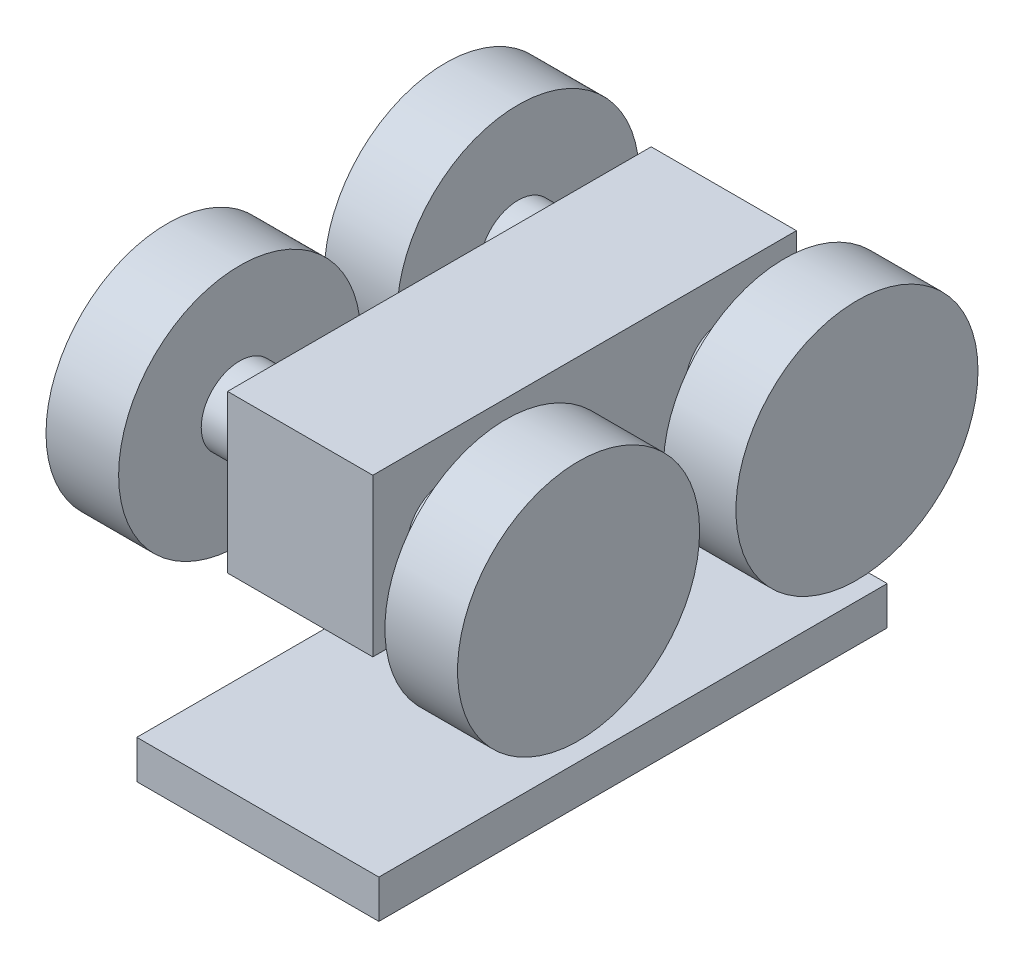
ISO-10303-21;
HEADER;
FILE_DESCRIPTION(('STEP AP214'),'2;1');
FILE_NAME('part.step','',(''),(''),'','','');
FILE_SCHEMA(('AUTOMOTIVE_DESIGN { 1 0 10303 214 1 1 1 1 }'));
ENDSEC;
DATA;
#1=APPLICATION_CONTEXT('core data for automotive mechanical design processes');
#2=APPLICATION_PROTOCOL_DEFINITION('international standard','automotive_design',2000,#1);
#3=PRODUCT_CONTEXT('',#1,'mechanical');
#4=PRODUCT('Part','Part','',(#3));
#5=PRODUCT_RELATED_PRODUCT_CATEGORY('part','',(#4));
#6=PRODUCT_DEFINITION_FORMATION('','',#4);
#7=PRODUCT_DEFINITION_CONTEXT('part definition',#1,'design');
#8=PRODUCT_DEFINITION('design','',#6,#7);
#9=PRODUCT_DEFINITION_SHAPE('','',#8);
#10=(LENGTH_UNIT() NAMED_UNIT(*) SI_UNIT(.MILLI.,.METRE.));
#11=(NAMED_UNIT(*) PLANE_ANGLE_UNIT() SI_UNIT($,.RADIAN.));
#12=(NAMED_UNIT(*) SI_UNIT($,.STERADIAN.) SOLID_ANGLE_UNIT());
#13=UNCERTAINTY_MEASURE_WITH_UNIT(LENGTH_MEASURE(1.E-05),#10,'distance_accuracy_value','');
#14=(GEOMETRIC_REPRESENTATION_CONTEXT(3) GLOBAL_UNCERTAINTY_ASSIGNED_CONTEXT((#13)) GLOBAL_UNIT_ASSIGNED_CONTEXT((#10,
#11,#12)) REPRESENTATION_CONTEXT('',''));
#15=CARTESIAN_POINT('',(0.,0.,0.));
#16=DIRECTION('',(0.,0.,1.));
#17=DIRECTION('',(1.,0.,0.));
#18=AXIS2_PLACEMENT_3D('',#15,#16,#17);
#19=CARTESIAN_POINT('',(27.,21.675,9.5));
#20=DIRECTION('',(-1.,0.,0.));
#21=DIRECTION('',(0.,0.,1.));
#22=AXIS2_PLACEMENT_3D('',#19,#20,#21);
#23=CYLINDRICAL_SURFACE('',#22,3.175);
#24=CARTESIAN_POINT('',(16.,21.675,9.5));
#25=DIRECTION('',(-1.,0.,0.));
#26=DIRECTION('',(0.,0.,1.));
#27=AXIS2_PLACEMENT_3D('',#24,#25,#26);
#28=CIRCLE('',#27,3.175);
#29=CARTESIAN_POINT('',(16.,21.675,12.675));
#30=VERTEX_POINT('',#29);
#31=EDGE_CURVE('E175',#30,#30,#28,.F.);
#32=ORIENTED_EDGE('',*,*,#31,.T.);
#33=EDGE_LOOP('',(#32));
#34=FACE_BOUND('',#33,.T.);
#35=CARTESIAN_POINT('',(21.,21.675,9.5));
#36=DIRECTION('',(1.,0.,0.));
#37=DIRECTION('',(0.,0.,-1.));
#38=AXIS2_PLACEMENT_3D('',#35,#36,#37);
#39=CIRCLE('',#38,3.175);
#40=CARTESIAN_POINT('',(21.,21.675,6.325));
#41=VERTEX_POINT('',#40);
#42=EDGE_CURVE('E11',#41,#41,#39,.T.);
#43=ORIENTED_EDGE('',*,*,#42,.F.);
#44=EDGE_LOOP('',(#43));
#45=FACE_BOUND('',#44,.T.);
#46=ADVANCED_FACE('F33',(#34,#45),#23,.T.);
#47=CARTESIAN_POINT('',(27.,21.675,32.5));
#48=DIRECTION('',(-1.,0.,0.));
#49=DIRECTION('',(0.,0.,1.));
#50=AXIS2_PLACEMENT_3D('',#47,#48,#49);
#51=CYLINDRICAL_SURFACE('',#50,3.175);
#52=CARTESIAN_POINT('',(16.,21.675,32.5));
#53=DIRECTION('',(-1.,0.,0.));
#54=DIRECTION('',(0.,0.,1.));
#55=AXIS2_PLACEMENT_3D('',#52,#53,#54);
#56=CIRCLE('',#55,3.175);
#57=CARTESIAN_POINT('',(16.,21.675,35.675));
#58=VERTEX_POINT('',#57);
#59=EDGE_CURVE('E172',#58,#58,#56,.F.);
#60=ORIENTED_EDGE('',*,*,#59,.T.);
#61=EDGE_LOOP('',(#60));
#62=FACE_BOUND('',#61,.T.);
#63=CARTESIAN_POINT('',(21.,21.675,32.5));
#64=DIRECTION('',(1.,0.,0.));
#65=DIRECTION('',(0.,0.,-1.));
#66=AXIS2_PLACEMENT_3D('',#63,#64,#65);
#67=CIRCLE('',#66,3.175);
#68=CARTESIAN_POINT('',(21.,21.675,29.325));
#69=VERTEX_POINT('',#68);
#70=EDGE_CURVE('E42',#69,#69,#67,.T.);
#71=ORIENTED_EDGE('',*,*,#70,.F.);
#72=EDGE_LOOP('',(#71));
#73=FACE_BOUND('',#72,.T.);
#74=ADVANCED_FACE('F189',(#62,#73),#51,.T.);
#75=CARTESIAN_POINT('',(-6.99999999999999,21.675,32.5));
#76=DIRECTION('',(1.,0.,0.));
#77=DIRECTION('',(0.,0.,-1.));
#78=AXIS2_PLACEMENT_3D('',#75,#76,#77);
#79=CYLINDRICAL_SURFACE('',#78,3.175);
#80=CARTESIAN_POINT('',(4.00000000000001,21.675,32.5));
#81=DIRECTION('',(1.,0.,0.));
#82=DIRECTION('',(0.,0.,-1.));
#83=AXIS2_PLACEMENT_3D('',#80,#81,#82);
#84=CIRCLE('',#83,3.175);
#85=CARTESIAN_POINT('',(4.00000000000001,21.675,29.325));
#86=VERTEX_POINT('',#85);
#87=EDGE_CURVE('E169',#86,#86,#84,.F.);
#88=ORIENTED_EDGE('',*,*,#87,.T.);
#89=EDGE_LOOP('',(#88));
#90=FACE_BOUND('',#89,.T.);
#91=CARTESIAN_POINT('',(-0.999999999999994,21.675,32.5));
#92=DIRECTION('',(-1.,0.,0.));
#93=DIRECTION('',(0.,0.,1.));
#94=AXIS2_PLACEMENT_3D('',#91,#92,#93);
#95=CIRCLE('',#94,3.175);
#96=CARTESIAN_POINT('',(-0.999999999999994,21.675,35.675));
#97=VERTEX_POINT('',#96);
#98=EDGE_CURVE('E181',#97,#97,#95,.T.);
#99=ORIENTED_EDGE('',*,*,#98,.F.);
#100=EDGE_LOOP('',(#99));
#101=FACE_BOUND('',#100,.T.);
#102=ADVANCED_FACE('F191',(#90,#101),#79,.T.);
#103=CARTESIAN_POINT('',(-6.99999999999999,21.675,9.5));
#104=DIRECTION('',(1.,0.,0.));
#105=DIRECTION('',(0.,0.,-1.));
#106=AXIS2_PLACEMENT_3D('',#103,#104,#105);
#107=CYLINDRICAL_SURFACE('',#106,3.175);
#108=CARTESIAN_POINT('',(4.00000000000001,21.675,9.5));
#109=DIRECTION('',(1.,0.,0.));
#110=DIRECTION('',(0.,0.,-1.));
#111=AXIS2_PLACEMENT_3D('',#108,#109,#110);
#112=CIRCLE('',#111,3.175);
#113=CARTESIAN_POINT('',(4.00000000000001,21.675,6.325));
#114=VERTEX_POINT('',#113);
#115=EDGE_CURVE('E166',#114,#114,#112,.F.);
#116=ORIENTED_EDGE('',*,*,#115,.T.);
#117=EDGE_LOOP('',(#116));
#118=FACE_BOUND('',#117,.T.);
#119=CARTESIAN_POINT('',(-0.999999999999994,21.675,9.5));
#120=DIRECTION('',(-1.,0.,0.));
#121=DIRECTION('',(0.,0.,1.));
#122=AXIS2_PLACEMENT_3D('',#119,#120,#121);
#123=CIRCLE('',#122,3.175);
#124=CARTESIAN_POINT('',(-0.999999999999994,21.675,12.675));
#125=VERTEX_POINT('',#124);
#126=EDGE_CURVE('E178',#125,#125,#123,.T.);
#127=ORIENTED_EDGE('',*,*,#126,.F.);
#128=EDGE_LOOP('',(#127));
#129=FACE_BOUND('',#128,.T.);
#130=ADVANCED_FACE('F198',(#118,#129),#107,.T.);
#131=CARTESIAN_POINT('',(0.,3.175,0.));
#132=DIRECTION('',(1.,0.,0.));
#133=DIRECTION('',(0.,0.,-1.));
#134=AXIS2_PLACEMENT_3D('',#131,#132,#133);
#135=PLANE('',#134);
#136=DIRECTION('',(0.,0.,1.));
#137=VECTOR('',#136,1.);
#138=CARTESIAN_POINT('',(0.,0.,0.));
#139=LINE('',#138,#137);
#140=CARTESIAN_POINT('',(0.,0.,0.));
#141=VERTEX_POINT('',#140);
#142=CARTESIAN_POINT('',(0.,0.,42.));
#143=VERTEX_POINT('',#142);
#144=EDGE_CURVE('E144',#141,#143,#139,.T.);
#145=ORIENTED_EDGE('',*,*,#144,.T.);
#146=DIRECTION('',(0.,-1.,0.));
#147=VECTOR('',#146,1.);
#148=CARTESIAN_POINT('',(0.,3.175,42.));
#149=LINE('',#148,#147);
#150=CARTESIAN_POINT('',(0.,3.175,42.));
#151=VERTEX_POINT('',#150);
#152=EDGE_CURVE('E164',#151,#143,#149,.T.);
#153=ORIENTED_EDGE('',*,*,#152,.F.);
#154=DIRECTION('',(0.,0.,1.));
#155=VECTOR('',#154,1.);
#156=CARTESIAN_POINT('',(0.,3.175,0.));
#157=LINE('',#156,#155);
#158=CARTESIAN_POINT('',(0.,3.175,0.));
#159=VERTEX_POINT('',#158);
#160=EDGE_CURVE('E146',#159,#151,#157,.T.);
#161=ORIENTED_EDGE('',*,*,#160,.F.);
#162=DIRECTION('',(0.,-1.,0.));
#163=VECTOR('',#162,1.);
#164=CARTESIAN_POINT('',(0.,3.175,0.));
#165=LINE('',#164,#163);
#166=EDGE_CURVE('E152',#159,#141,#165,.T.);
#167=ORIENTED_EDGE('',*,*,#166,.T.);
#168=EDGE_LOOP('',(#145,#153,#161,#167));
#169=FACE_BOUND('',#168,.T.);
#170=ADVANCED_FACE('F35',(#169),#135,.F.);
#171=CARTESIAN_POINT('',(0.,3.175,42.));
#172=DIRECTION('',(0.,0.,-1.));
#173=DIRECTION('',(-1.,0.,0.));
#174=AXIS2_PLACEMENT_3D('',#171,#172,#173);
#175=PLANE('',#174);
#176=DIRECTION('',(1.,0.,0.));
#177=VECTOR('',#176,1.);
#178=CARTESIAN_POINT('',(0.,0.,42.));
#179=LINE('',#178,#177);
#180=CARTESIAN_POINT('',(20.,0.,42.));
#181=VERTEX_POINT('',#180);
#182=EDGE_CURVE('E155',#143,#181,#179,.T.);
#183=ORIENTED_EDGE('',*,*,#182,.T.);
#184=DIRECTION('',(0.,-1.,0.));
#185=VECTOR('',#184,1.);
#186=CARTESIAN_POINT('',(20.,3.175,42.));
#187=LINE('',#186,#185);
#188=CARTESIAN_POINT('',(20.,3.175,42.));
#189=VERTEX_POINT('',#188);
#190=EDGE_CURVE('E162',#189,#181,#187,.T.);
#191=ORIENTED_EDGE('',*,*,#190,.F.);
#192=DIRECTION('',(1.,0.,0.));
#193=VECTOR('',#192,1.);
#194=CARTESIAN_POINT('',(0.,3.175,42.));
#195=LINE('',#194,#193);
#196=EDGE_CURVE('E82',#151,#189,#195,.T.);
#197=ORIENTED_EDGE('',*,*,#196,.F.);
#198=ORIENTED_EDGE('',*,*,#152,.T.);
#199=EDGE_LOOP('',(#183,#191,#197,#198));
#200=FACE_BOUND('',#199,.T.);
#201=ADVANCED_FACE('F258',(#200),#175,.F.);
#202=CARTESIAN_POINT('',(20.,3.175,0.));
#203=DIRECTION('',(-1.,0.,0.));
#204=DIRECTION('',(0.,0.,1.));
#205=AXIS2_PLACEMENT_3D('',#202,#203,#204);
#206=PLANE('',#205);
#207=DIRECTION('',(0.,0.,-1.));
#208=VECTOR('',#207,1.);
#209=CARTESIAN_POINT('',(20.,0.,0.));
#210=LINE('',#209,#208);
#211=CARTESIAN_POINT('',(20.,0.,0.));
#212=VERTEX_POINT('',#211);
#213=EDGE_CURVE('E68',#181,#212,#210,.T.);
#214=ORIENTED_EDGE('',*,*,#213,.T.);
#215=DIRECTION('',(0.,-1.,0.));
#216=VECTOR('',#215,1.);
#217=CARTESIAN_POINT('',(20.,3.175,0.));
#218=LINE('',#217,#216);
#219=CARTESIAN_POINT('',(20.,3.175,0.));
#220=VERTEX_POINT('',#219);
#221=EDGE_CURVE('E160',#220,#212,#218,.T.);
#222=ORIENTED_EDGE('',*,*,#221,.F.);
#223=DIRECTION('',(0.,0.,-1.));
#224=VECTOR('',#223,1.);
#225=CARTESIAN_POINT('',(20.,3.175,0.));
#226=LINE('',#225,#224);
#227=EDGE_CURVE('E149',#189,#220,#226,.T.);
#228=ORIENTED_EDGE('',*,*,#227,.F.);
#229=ORIENTED_EDGE('',*,*,#190,.T.);
#230=EDGE_LOOP('',(#214,#222,#228,#229));
#231=FACE_BOUND('',#230,.T.);
#232=ADVANCED_FACE('F256',(#231),#206,.F.);
#233=CARTESIAN_POINT('',(0.,3.175,0.));
#234=DIRECTION('',(0.,0.,1.));
#235=DIRECTION('',(1.,0.,0.));
#236=AXIS2_PLACEMENT_3D('',#233,#234,#235);
#237=PLANE('',#236);
#238=DIRECTION('',(-1.,0.,0.));
#239=VECTOR('',#238,1.);
#240=CARTESIAN_POINT('',(0.,0.,0.));
#241=LINE('',#240,#239);
#242=EDGE_CURVE('E74',#212,#141,#241,.T.);
#243=ORIENTED_EDGE('',*,*,#242,.T.);
#244=ORIENTED_EDGE('',*,*,#166,.F.);
#245=DIRECTION('',(-1.,0.,0.));
#246=VECTOR('',#245,1.);
#247=CARTESIAN_POINT('',(0.,3.175,0.));
#248=LINE('',#247,#246);
#249=EDGE_CURVE('E50',#220,#159,#248,.T.);
#250=ORIENTED_EDGE('',*,*,#249,.F.);
#251=ORIENTED_EDGE('',*,*,#221,.T.);
#252=EDGE_LOOP('',(#243,#244,#250,#251));
#253=FACE_BOUND('',#252,.T.);
#254=ADVANCED_FACE('F249',(#253),#237,.F.);
#255=CARTESIAN_POINT('',(0.,3.175,0.));
#256=DIRECTION('',(0.,1.,0.));
#257=DIRECTION('',(0.,0.,1.));
#258=AXIS2_PLACEMENT_3D('',#255,#256,#257);
#259=PLANE('',#258);
#260=CARTESIAN_POINT('',(10.,3.175,21.));
#261=DIRECTION('',(0.,1.,0.));
#262=DIRECTION('',(0.,0.,1.));
#263=AXIS2_PLACEMENT_3D('',#260,#261,#262);
#264=CIRCLE('',#263,3.175);
#265=CARTESIAN_POINT('',(10.,3.175,24.175));
#266=VERTEX_POINT('',#265);
#267=EDGE_CURVE('E134',#266,#266,#264,.T.);
#268=ORIENTED_EDGE('',*,*,#267,.F.);
#269=EDGE_LOOP('',(#268));
#270=FACE_BOUND('',#269,.T.);
#271=ORIENTED_EDGE('',*,*,#160,.T.);
#272=ORIENTED_EDGE('',*,*,#196,.T.);
#273=ORIENTED_EDGE('',*,*,#227,.T.);
#274=ORIENTED_EDGE('',*,*,#249,.T.);
#275=EDGE_LOOP('',(#271,#272,#273,#274));
#276=FACE_BOUND('',#275,.T.);
#277=ADVANCED_FACE('F246',(#270,#276),#259,.T.);
#278=CARTESIAN_POINT('',(0.,0.,0.));
#279=DIRECTION('',(0.,1.,0.));
#280=DIRECTION('',(0.,0.,1.));
#281=AXIS2_PLACEMENT_3D('',#278,#279,#280);
#282=PLANE('',#281);
#283=ORIENTED_EDGE('',*,*,#144,.F.);
#284=ORIENTED_EDGE('',*,*,#242,.F.);
#285=ORIENTED_EDGE('',*,*,#213,.F.);
#286=ORIENTED_EDGE('',*,*,#182,.F.);
#287=EDGE_LOOP('',(#283,#284,#285,#286));
#288=FACE_BOUND('',#287,.T.);
#289=ADVANCED_FACE('F244',(#288),#282,.F.);
#290=CARTESIAN_POINT('',(10.,15.175,21.));
#291=DIRECTION('',(0.,-1.,0.));
#292=DIRECTION('',(0.,0.,-1.));
#293=AXIS2_PLACEMENT_3D('',#290,#291,#292);
#294=CYLINDRICAL_SURFACE('',#293,3.175);
#295=CARTESIAN_POINT('',(10.,15.175,21.));
#296=DIRECTION('',(0.,1.,0.));
#297=DIRECTION('',(0.,0.,1.));
#298=AXIS2_PLACEMENT_3D('',#295,#296,#297);
#299=CIRCLE('',#298,3.175);
#300=CARTESIAN_POINT('',(10.,15.175,24.175));
#301=VERTEX_POINT('',#300);
#302=EDGE_CURVE('E137',#301,#301,#299,.T.);
#303=ORIENTED_EDGE('',*,*,#302,.F.);
#304=EDGE_LOOP('',(#303));
#305=FACE_BOUND('',#304,.T.);
#306=ORIENTED_EDGE('',*,*,#267,.T.);
#307=EDGE_LOOP('',(#306));
#308=FACE_BOUND('',#307,.T.);
#309=ADVANCED_FACE('F240',(#305,#308),#294,.T.);
#310=CARTESIAN_POINT('',(16.,28.175,38.5));
#311=DIRECTION('',(-1.,0.,0.));
#312=DIRECTION('',(0.,0.,1.));
#313=AXIS2_PLACEMENT_3D('',#310,#311,#312);
#314=PLANE('',#313);
#315=ORIENTED_EDGE('',*,*,#31,.F.);
#316=EDGE_LOOP('',(#315));
#317=FACE_BOUND('',#316,.T.);
#318=ORIENTED_EDGE('',*,*,#59,.F.);
#319=EDGE_LOOP('',(#318));
#320=FACE_BOUND('',#319,.T.);
#321=DIRECTION('',(0.,0.,-1.));
#322=VECTOR('',#321,1.);
#323=CARTESIAN_POINT('',(16.,15.175,38.5));
#324=LINE('',#323,#322);
#325=CARTESIAN_POINT('',(16.,15.175,38.5));
#326=VERTEX_POINT('',#325);
#327=CARTESIAN_POINT('',(16.,15.175,3.5));
#328=VERTEX_POINT('',#327);
#329=EDGE_CURVE('E133',#326,#328,#324,.T.);
#330=ORIENTED_EDGE('',*,*,#329,.T.);
#331=DIRECTION('',(0.,-1.,0.));
#332=VECTOR('',#331,1.);
#333=CARTESIAN_POINT('',(16.,28.175,3.5));
#334=LINE('',#333,#332);
#335=CARTESIAN_POINT('',(16.,28.175,3.5));
#336=VERTEX_POINT('',#335);
#337=EDGE_CURVE('E113',#336,#328,#334,.T.);
#338=ORIENTED_EDGE('',*,*,#337,.F.);
#339=DIRECTION('',(0.,0.,-1.));
#340=VECTOR('',#339,1.);
#341=CARTESIAN_POINT('',(16.,28.175,38.5));
#342=LINE('',#341,#340);
#343=CARTESIAN_POINT('',(16.,28.175,38.5));
#344=VERTEX_POINT('',#343);
#345=EDGE_CURVE('E120',#344,#336,#342,.T.);
#346=ORIENTED_EDGE('',*,*,#345,.F.);
#347=DIRECTION('',(0.,-1.,0.));
#348=VECTOR('',#347,1.);
#349=CARTESIAN_POINT('',(16.,28.175,38.5));
#350=LINE('',#349,#348);
#351=EDGE_CURVE('E510',#344,#326,#350,.T.);
#352=ORIENTED_EDGE('',*,*,#351,.T.);
#353=EDGE_LOOP('',(#330,#338,#346,#352));
#354=FACE_BOUND('',#353,.T.);
#355=ADVANCED_FACE('F131',(#317,#320,#354),#314,.F.);
#356=CARTESIAN_POINT('',(4.00000000000001,28.175,3.5));
#357=DIRECTION('',(0.,0.,1.));
#358=DIRECTION('',(1.,0.,0.));
#359=AXIS2_PLACEMENT_3D('',#356,#357,#358);
#360=PLANE('',#359);
#361=DIRECTION('',(-1.,0.,0.));
#362=VECTOR('',#361,1.);
#363=CARTESIAN_POINT('',(4.00000000000001,15.175,3.5));
#364=LINE('',#363,#362);
#365=CARTESIAN_POINT('',(4.00000000000001,15.175,3.5));
#366=VERTEX_POINT('',#365);
#367=EDGE_CURVE('E512',#328,#366,#364,.T.);
#368=ORIENTED_EDGE('',*,*,#367,.T.);
#369=DIRECTION('',(0.,-1.,0.));
#370=VECTOR('',#369,1.);
#371=CARTESIAN_POINT('',(4.00000000000001,28.175,3.5));
#372=LINE('',#371,#370);
#373=CARTESIAN_POINT('',(4.00000000000001,28.175,3.5));
#374=VERTEX_POINT('',#373);
#375=EDGE_CURVE('E116',#374,#366,#372,.T.);
#376=ORIENTED_EDGE('',*,*,#375,.F.);
#377=DIRECTION('',(-1.,0.,0.));
#378=VECTOR('',#377,1.);
#379=CARTESIAN_POINT('',(4.00000000000001,28.175,3.5));
#380=LINE('',#379,#378);
#381=EDGE_CURVE('E109',#336,#374,#380,.T.);
#382=ORIENTED_EDGE('',*,*,#381,.F.);
#383=ORIENTED_EDGE('',*,*,#337,.T.);
#384=EDGE_LOOP('',(#368,#376,#382,#383));
#385=FACE_BOUND('',#384,.T.);
#386=ADVANCED_FACE('F111',(#385),#360,.F.);
#387=CARTESIAN_POINT('',(4.00000000000001,28.175,38.5));
#388=DIRECTION('',(1.,0.,0.));
#389=DIRECTION('',(0.,0.,-1.));
#390=AXIS2_PLACEMENT_3D('',#387,#388,#389);
#391=PLANE('',#390);
#392=ORIENTED_EDGE('',*,*,#87,.F.);
#393=EDGE_LOOP('',(#392));
#394=FACE_BOUND('',#393,.T.);
#395=ORIENTED_EDGE('',*,*,#115,.F.);
#396=EDGE_LOOP('',(#395));
#397=FACE_BOUND('',#396,.T.);
#398=DIRECTION('',(0.,0.,1.));
#399=VECTOR('',#398,1.);
#400=CARTESIAN_POINT('',(4.00000000000001,15.175,38.5));
#401=LINE('',#400,#399);
#402=CARTESIAN_POINT('',(4.00000000000001,15.175,38.5));
#403=VERTEX_POINT('',#402);
#404=EDGE_CURVE('E514',#366,#403,#401,.T.);
#405=ORIENTED_EDGE('',*,*,#404,.T.);
#406=DIRECTION('',(0.,-1.,0.));
#407=VECTOR('',#406,1.);
#408=CARTESIAN_POINT('',(4.00000000000001,28.175,38.5));
#409=LINE('',#408,#407);
#410=CARTESIAN_POINT('',(4.00000000000001,28.175,38.5));
#411=VERTEX_POINT('',#410);
#412=EDGE_CURVE('E139',#411,#403,#409,.T.);
#413=ORIENTED_EDGE('',*,*,#412,.F.);
#414=DIRECTION('',(0.,0.,1.));
#415=VECTOR('',#414,1.);
#416=CARTESIAN_POINT('',(4.00000000000001,28.175,38.5));
#417=LINE('',#416,#415);
#418=EDGE_CURVE('E119',#374,#411,#417,.T.);
#419=ORIENTED_EDGE('',*,*,#418,.F.);
#420=ORIENTED_EDGE('',*,*,#375,.T.);
#421=EDGE_LOOP('',(#405,#413,#419,#420));
#422=FACE_BOUND('',#421,.T.);
#423=ADVANCED_FACE('F231',(#394,#397,#422),#391,.F.);
#424=CARTESIAN_POINT('',(4.00000000000001,28.175,38.5));
#425=DIRECTION('',(0.,0.,-1.));
#426=DIRECTION('',(-1.,0.,0.));
#427=AXIS2_PLACEMENT_3D('',#424,#425,#426);
#428=PLANE('',#427);
#429=DIRECTION('',(1.,0.,0.));
#430=VECTOR('',#429,1.);
#431=CARTESIAN_POINT('',(4.00000000000001,15.175,38.5));
#432=LINE('',#431,#430);
#433=EDGE_CURVE('E129',#403,#326,#432,.T.);
#434=ORIENTED_EDGE('',*,*,#433,.T.);
#435=ORIENTED_EDGE('',*,*,#351,.F.);
#436=DIRECTION('',(1.,0.,0.));
#437=VECTOR('',#436,1.);
#438=CARTESIAN_POINT('',(4.00000000000001,28.175,38.5));
#439=LINE('',#438,#437);
#440=EDGE_CURVE('E125',#411,#344,#439,.T.);
#441=ORIENTED_EDGE('',*,*,#440,.F.);
#442=ORIENTED_EDGE('',*,*,#412,.T.);
#443=EDGE_LOOP('',(#434,#435,#441,#442));
#444=FACE_BOUND('',#443,.T.);
#445=ADVANCED_FACE('F224',(#444),#428,.F.);
#446=CARTESIAN_POINT('',(0.,28.175,0.));
#447=DIRECTION('',(0.,-1.,0.));
#448=DIRECTION('',(0.,0.,-1.));
#449=AXIS2_PLACEMENT_3D('',#446,#447,#448);
#450=PLANE('',#449);
#451=ORIENTED_EDGE('',*,*,#345,.T.);
#452=ORIENTED_EDGE('',*,*,#381,.T.);
#453=ORIENTED_EDGE('',*,*,#418,.T.);
#454=ORIENTED_EDGE('',*,*,#440,.T.);
#455=EDGE_LOOP('',(#451,#452,#453,#454));
#456=FACE_BOUND('',#455,.T.);
#457=ADVANCED_FACE('F123',(#456),#450,.F.);
#458=CARTESIAN_POINT('',(0.,15.175,0.));
#459=DIRECTION('',(0.,-1.,0.));
#460=DIRECTION('',(0.,0.,-1.));
#461=AXIS2_PLACEMENT_3D('',#458,#459,#460);
#462=PLANE('',#461);
#463=ORIENTED_EDGE('',*,*,#302,.T.);
#464=EDGE_LOOP('',(#463));
#465=FACE_BOUND('',#464,.T.);
#466=ORIENTED_EDGE('',*,*,#329,.F.);
#467=ORIENTED_EDGE('',*,*,#433,.F.);
#468=ORIENTED_EDGE('',*,*,#404,.F.);
#469=ORIENTED_EDGE('',*,*,#367,.F.);
#470=EDGE_LOOP('',(#466,#467,#468,#469));
#471=FACE_BOUND('',#470,.T.);
#472=ADVANCED_FACE('F223',(#465,#471),#462,.T.);
#473=CARTESIAN_POINT('',(-0.999999999999994,21.675,9.5));
#474=DIRECTION('',(-1.,0.,0.));
#475=DIRECTION('',(0.,0.,1.));
#476=AXIS2_PLACEMENT_3D('',#473,#474,#475);
#477=CYLINDRICAL_SURFACE('',#476,10.);
#478=CARTESIAN_POINT('',(-0.999999999999994,21.675,9.5));
#479=DIRECTION('',(-1.,0.,0.));
#480=DIRECTION('',(0.,0.,1.));
#481=AXIS2_PLACEMENT_3D('',#478,#479,#480);
#482=CIRCLE('',#481,10.);
#483=CARTESIAN_POINT('',(-0.999999999999994,21.675,19.5));
#484=VERTEX_POINT('',#483);
#485=EDGE_CURVE('E503',#484,#484,#482,.T.);
#486=ORIENTED_EDGE('',*,*,#485,.T.);
#487=EDGE_LOOP('',(#486));
#488=FACE_BOUND('',#487,.T.);
#489=CARTESIAN_POINT('',(-6.99999999999999,21.675,9.5));
#490=DIRECTION('',(-1.,0.,0.));
#491=DIRECTION('',(0.,0.,1.));
#492=AXIS2_PLACEMENT_3D('',#489,#490,#491);
#493=CIRCLE('',#492,10.);
#494=CARTESIAN_POINT('',(-6.99999999999999,21.675,19.5));
#495=VERTEX_POINT('',#494);
#496=EDGE_CURVE('E500',#495,#495,#493,.T.);
#497=ORIENTED_EDGE('',*,*,#496,.F.);
#498=EDGE_LOOP('',(#497));
#499=FACE_BOUND('',#498,.T.);
#500=ADVANCED_FACE('F227',(#488,#499),#477,.T.);
#501=CARTESIAN_POINT('',(-0.999999999999994,21.675,9.5));
#502=DIRECTION('',(-1.,0.,0.));
#503=DIRECTION('',(0.,0.,1.));
#504=AXIS2_PLACEMENT_3D('',#501,#502,#503);
#505=PLANE('',#504);
#506=ORIENTED_EDGE('',*,*,#126,.T.);
#507=EDGE_LOOP('',(#506));
#508=FACE_BOUND('',#507,.T.);
#509=ORIENTED_EDGE('',*,*,#485,.F.);
#510=EDGE_LOOP('',(#509));
#511=FACE_BOUND('',#510,.T.);
#512=ADVANCED_FACE('F216',(#508,#511),#505,.F.);
#513=CARTESIAN_POINT('',(-6.99999999999999,21.675,9.5));
#514=DIRECTION('',(-1.,0.,0.));
#515=DIRECTION('',(0.,0.,1.));
#516=AXIS2_PLACEMENT_3D('',#513,#514,#515);
#517=PLANE('',#516);
#518=ORIENTED_EDGE('',*,*,#496,.T.);
#519=EDGE_LOOP('',(#518));
#520=FACE_BOUND('',#519,.T.);
#521=ADVANCED_FACE('F212',(#520),#517,.T.);
#522=CARTESIAN_POINT('',(-0.999999999999994,21.675,32.5));
#523=DIRECTION('',(-1.,0.,0.));
#524=DIRECTION('',(0.,0.,1.));
#525=AXIS2_PLACEMENT_3D('',#522,#523,#524);
#526=CYLINDRICAL_SURFACE('',#525,10.);
#527=CARTESIAN_POINT('',(-0.999999999999994,21.675,32.5));
#528=DIRECTION('',(-1.,0.,0.));
#529=DIRECTION('',(0.,0.,1.));
#530=AXIS2_PLACEMENT_3D('',#527,#528,#529);
#531=CIRCLE('',#530,10.);
#532=CARTESIAN_POINT('',(-0.999999999999994,21.675,42.5));
#533=VERTEX_POINT('',#532);
#534=EDGE_CURVE('E497',#533,#533,#531,.T.);
#535=ORIENTED_EDGE('',*,*,#534,.T.);
#536=EDGE_LOOP('',(#535));
#537=FACE_BOUND('',#536,.T.);
#538=CARTESIAN_POINT('',(-6.99999999999999,21.675,32.5));
#539=DIRECTION('',(-1.,0.,0.));
#540=DIRECTION('',(0.,0.,1.));
#541=AXIS2_PLACEMENT_3D('',#538,#539,#540);
#542=CIRCLE('',#541,10.);
#543=CARTESIAN_POINT('',(-6.99999999999999,21.675,42.5));
#544=VERTEX_POINT('',#543);
#545=EDGE_CURVE('E494',#544,#544,#542,.T.);
#546=ORIENTED_EDGE('',*,*,#545,.F.);
#547=EDGE_LOOP('',(#546));
#548=FACE_BOUND('',#547,.T.);
#549=ADVANCED_FACE('F215',(#537,#548),#526,.T.);
#550=CARTESIAN_POINT('',(-0.999999999999994,21.675,32.5));
#551=DIRECTION('',(-1.,0.,0.));
#552=DIRECTION('',(0.,0.,1.));
#553=AXIS2_PLACEMENT_3D('',#550,#551,#552);
#554=PLANE('',#553);
#555=ORIENTED_EDGE('',*,*,#98,.T.);
#556=EDGE_LOOP('',(#555));
#557=FACE_BOUND('',#556,.T.);
#558=ORIENTED_EDGE('',*,*,#534,.F.);
#559=EDGE_LOOP('',(#558));
#560=FACE_BOUND('',#559,.T.);
#561=ADVANCED_FACE('F209',(#557,#560),#554,.F.);
#562=CARTESIAN_POINT('',(-6.99999999999999,21.675,32.5));
#563=DIRECTION('',(-1.,0.,0.));
#564=DIRECTION('',(0.,0.,1.));
#565=AXIS2_PLACEMENT_3D('',#562,#563,#564);
#566=PLANE('',#565);
#567=ORIENTED_EDGE('',*,*,#545,.T.);
#568=EDGE_LOOP('',(#567));
#569=FACE_BOUND('',#568,.T.);
#570=ADVANCED_FACE('F206',(#569),#566,.T.);
#571=CARTESIAN_POINT('',(21.,21.675,32.5));
#572=DIRECTION('',(1.,0.,0.));
#573=DIRECTION('',(0.,0.,-1.));
#574=AXIS2_PLACEMENT_3D('',#571,#572,#573);
#575=CYLINDRICAL_SURFACE('',#574,10.);
#576=CARTESIAN_POINT('',(21.,21.675,32.5));
#577=DIRECTION('',(1.,0.,0.));
#578=DIRECTION('',(0.,0.,-1.));
#579=AXIS2_PLACEMENT_3D('',#576,#577,#578);
#580=CIRCLE('',#579,10.);
#581=CARTESIAN_POINT('',(21.,21.675,22.5));
#582=VERTEX_POINT('',#581);
#583=EDGE_CURVE('E491',#582,#582,#580,.T.);
#584=ORIENTED_EDGE('',*,*,#583,.T.);
#585=EDGE_LOOP('',(#584));
#586=FACE_BOUND('',#585,.T.);
#587=CARTESIAN_POINT('',(27.,21.675,32.5));
#588=DIRECTION('',(1.,0.,0.));
#589=DIRECTION('',(0.,0.,-1.));
#590=AXIS2_PLACEMENT_3D('',#587,#588,#589);
#591=CIRCLE('',#590,10.);
#592=CARTESIAN_POINT('',(27.,21.675,22.5));
#593=VERTEX_POINT('',#592);
#594=EDGE_CURVE('E488',#593,#593,#591,.T.);
#595=ORIENTED_EDGE('',*,*,#594,.F.);
#596=EDGE_LOOP('',(#595));
#597=FACE_BOUND('',#596,.T.);
#598=ADVANCED_FACE('F208',(#586,#597),#575,.T.);
#599=CARTESIAN_POINT('',(21.,21.675,32.5));
#600=DIRECTION('',(1.,0.,0.));
#601=DIRECTION('',(0.,0.,-1.));
#602=AXIS2_PLACEMENT_3D('',#599,#600,#601);
#603=PLANE('',#602);
#604=ORIENTED_EDGE('',*,*,#70,.T.);
#605=EDGE_LOOP('',(#604));
#606=FACE_BOUND('',#605,.T.);
#607=ORIENTED_EDGE('',*,*,#583,.F.);
#608=EDGE_LOOP('',(#607));
#609=FACE_BOUND('',#608,.T.);
#610=ADVANCED_FACE('F186',(#606,#609),#603,.F.);
#611=CARTESIAN_POINT('',(27.,21.675,32.5));
#612=DIRECTION('',(1.,0.,0.));
#613=DIRECTION('',(0.,0.,-1.));
#614=AXIS2_PLACEMENT_3D('',#611,#612,#613);
#615=PLANE('',#614);
#616=ORIENTED_EDGE('',*,*,#594,.T.);
#617=EDGE_LOOP('',(#616));
#618=FACE_BOUND('',#617,.T.);
#619=ADVANCED_FACE('F205',(#618),#615,.T.);
#620=CARTESIAN_POINT('',(21.,21.675,9.5));
#621=DIRECTION('',(1.,0.,0.));
#622=DIRECTION('',(0.,0.,-1.));
#623=AXIS2_PLACEMENT_3D('',#620,#621,#622);
#624=CYLINDRICAL_SURFACE('',#623,10.);
#625=CARTESIAN_POINT('',(21.,21.675,9.5));
#626=DIRECTION('',(1.,0.,0.));
#627=DIRECTION('',(0.,0.,-1.));
#628=AXIS2_PLACEMENT_3D('',#625,#626,#627);
#629=CIRCLE('',#628,10.);
#630=CARTESIAN_POINT('',(21.,21.675,-0.500000000000006));
#631=VERTEX_POINT('',#630);
#632=EDGE_CURVE('E485',#631,#631,#629,.T.);
#633=ORIENTED_EDGE('',*,*,#632,.T.);
#634=EDGE_LOOP('',(#633));
#635=FACE_BOUND('',#634,.T.);
#636=CARTESIAN_POINT('',(27.,21.675,9.5));
#637=DIRECTION('',(1.,0.,0.));
#638=DIRECTION('',(0.,0.,-1.));
#639=AXIS2_PLACEMENT_3D('',#636,#637,#638);
#640=CIRCLE('',#639,10.);
#641=CARTESIAN_POINT('',(27.,21.675,-0.500000000000006));
#642=VERTEX_POINT('',#641);
#643=EDGE_CURVE('E483',#642,#642,#640,.T.);
#644=ORIENTED_EDGE('',*,*,#643,.F.);
#645=EDGE_LOOP('',(#644));
#646=FACE_BOUND('',#645,.T.);
#647=ADVANCED_FACE('F409',(#635,#646),#624,.T.);
#648=CARTESIAN_POINT('',(21.,21.675,9.5));
#649=DIRECTION('',(1.,0.,0.));
#650=DIRECTION('',(0.,0.,-1.));
#651=AXIS2_PLACEMENT_3D('',#648,#649,#650);
#652=PLANE('',#651);
#653=ORIENTED_EDGE('',*,*,#42,.T.);
#654=EDGE_LOOP('',(#653));
#655=FACE_BOUND('',#654,.T.);
#656=ORIENTED_EDGE('',*,*,#632,.F.);
#657=EDGE_LOOP('',(#656));
#658=FACE_BOUND('',#657,.T.);
#659=ADVANCED_FACE('F416',(#655,#658),#652,.F.);
#660=CARTESIAN_POINT('',(27.,21.675,9.5));
#661=DIRECTION('',(1.,0.,0.));
#662=DIRECTION('',(0.,0.,-1.));
#663=AXIS2_PLACEMENT_3D('',#660,#661,#662);
#664=PLANE('',#663);
#665=ORIENTED_EDGE('',*,*,#643,.T.);
#666=EDGE_LOOP('',(#665));
#667=FACE_BOUND('',#666,.T.);
#668=ADVANCED_FACE('F424',(#667),#664,.T.);
#669=CLOSED_SHELL('',(#46,#74,#102,#130,#170,#201,#232,#254,#277,#289,#309,#355,#386,#423,#445,
#457,#472,#500,#512,#521,#549,#561,#570,#598,#610,#619,#647,#659,#668));
#670=MANIFOLD_SOLID_BREP('B2',#669);
#671=ADVANCED_BREP_SHAPE_REPRESENTATION('',(#18,#670),#14);
#672=SHAPE_DEFINITION_REPRESENTATION(#9,#671);
ENDSEC;
END-ISO-10303-21;
